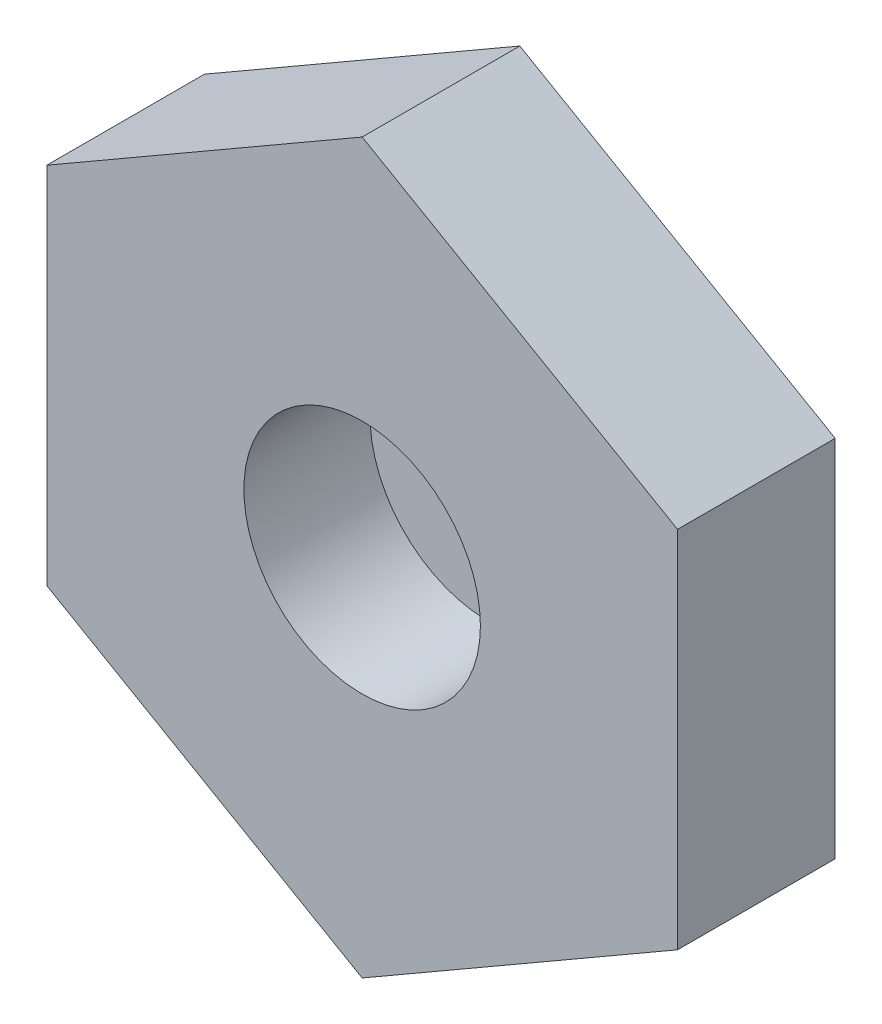
ISO-10303-21;
HEADER;
FILE_DESCRIPTION(('STEP AP214'),'2;1');
FILE_NAME('part.step','',(''),(''),'','','');
FILE_SCHEMA(('AUTOMOTIVE_DESIGN { 1 0 10303 214 1 1 1 1 }'));
ENDSEC;
DATA;
#1=APPLICATION_CONTEXT('core data for automotive mechanical design processes');
#2=APPLICATION_PROTOCOL_DEFINITION('international standard','automotive_design',2000,#1);
#3=PRODUCT_CONTEXT('',#1,'mechanical');
#4=PRODUCT('Part','Part','',(#3));
#5=PRODUCT_RELATED_PRODUCT_CATEGORY('part','',(#4));
#6=PRODUCT_DEFINITION_FORMATION('','',#4);
#7=PRODUCT_DEFINITION_CONTEXT('part definition',#1,'design');
#8=PRODUCT_DEFINITION('design','',#6,#7);
#9=PRODUCT_DEFINITION_SHAPE('','',#8);
#10=(LENGTH_UNIT() NAMED_UNIT(*) SI_UNIT(.MILLI.,.METRE.));
#11=(NAMED_UNIT(*) PLANE_ANGLE_UNIT() SI_UNIT($,.RADIAN.));
#12=(NAMED_UNIT(*) SI_UNIT($,.STERADIAN.) SOLID_ANGLE_UNIT());
#13=UNCERTAINTY_MEASURE_WITH_UNIT(LENGTH_MEASURE(1.E-05),#10,'distance_accuracy_value','');
#14=(GEOMETRIC_REPRESENTATION_CONTEXT(3) GLOBAL_UNCERTAINTY_ASSIGNED_CONTEXT((#13)) GLOBAL_UNIT_ASSIGNED_CONTEXT((#10,
#11,#12)) REPRESENTATION_CONTEXT('',''));
#15=CARTESIAN_POINT('',(0.,0.,0.));
#16=DIRECTION('',(0.,0.,1.));
#17=DIRECTION('',(1.,0.,0.));
#18=AXIS2_PLACEMENT_3D('',#15,#16,#17);
#19=CARTESIAN_POINT('',(8.,4.61880215351701,4.));
#20=DIRECTION('',(-0.5,-0.866025403784439,0.));
#21=DIRECTION('',(0.866025403784439,-0.5,0.));
#22=AXIS2_PLACEMENT_3D('',#19,#20,#21);
#23=PLANE('',#22);
#24=DIRECTION('',(-0.866025403784438,0.5,0.));
#25=VECTOR('',#24,1.);
#26=CARTESIAN_POINT('',(8.,4.61880215351701,0.));
#27=LINE('',#26,#25);
#28=CARTESIAN_POINT('',(8.,4.61880215351701,0.));
#29=VERTEX_POINT('',#28);
#30=CARTESIAN_POINT('',(0.,9.23760430703402,0.));
#31=VERTEX_POINT('',#30);
#32=EDGE_CURVE('E118',#29,#31,#27,.T.);
#33=ORIENTED_EDGE('',*,*,#32,.T.);
#34=DIRECTION('',(0.,0.,-1.));
#35=VECTOR('',#34,1.);
#36=CARTESIAN_POINT('',(0.,9.23760430703402,4.));
#37=LINE('',#36,#35);
#38=CARTESIAN_POINT('',(0.,9.23760430703402,4.));
#39=VERTEX_POINT('',#38);
#40=EDGE_CURVE('E11',#39,#31,#37,.T.);
#41=ORIENTED_EDGE('',*,*,#40,.F.);
#42=DIRECTION('',(-0.866025403784438,0.5,0.));
#43=VECTOR('',#42,1.);
#44=CARTESIAN_POINT('',(8.,4.61880215351701,4.));
#45=LINE('',#44,#43);
#46=CARTESIAN_POINT('',(8.,4.61880215351701,4.));
#47=VERTEX_POINT('',#46);
#48=EDGE_CURVE('E129',#47,#39,#45,.T.);
#49=ORIENTED_EDGE('',*,*,#48,.F.);
#50=DIRECTION('',(0.,0.,-1.));
#51=VECTOR('',#50,1.);
#52=CARTESIAN_POINT('',(8.,4.61880215351701,4.));
#53=LINE('',#52,#51);
#54=EDGE_CURVE('E114',#47,#29,#53,.T.);
#55=ORIENTED_EDGE('',*,*,#54,.T.);
#56=EDGE_LOOP('',(#33,#41,#49,#55));
#57=FACE_BOUND('',#56,.T.);
#58=ADVANCED_FACE('F34',(#57),#23,.F.);
#59=CARTESIAN_POINT('',(0.,9.23760430703402,4.));
#60=DIRECTION('',(0.5,-0.866025403784439,0.));
#61=DIRECTION('',(0.866025403784439,0.5,0.));
#62=AXIS2_PLACEMENT_3D('',#59,#60,#61);
#63=PLANE('',#62);
#64=DIRECTION('',(-0.866025403784439,-0.5,0.));
#65=VECTOR('',#64,1.);
#66=CARTESIAN_POINT('',(0.,9.23760430703402,0.));
#67=LINE('',#66,#65);
#68=CARTESIAN_POINT('',(-8.,4.61880215351701,0.));
#69=VERTEX_POINT('',#68);
#70=EDGE_CURVE('E121',#31,#69,#67,.T.);
#71=ORIENTED_EDGE('',*,*,#70,.T.);
#72=DIRECTION('',(0.,0.,-1.));
#73=VECTOR('',#72,1.);
#74=CARTESIAN_POINT('',(-8.,4.61880215351701,4.));
#75=LINE('',#74,#73);
#76=CARTESIAN_POINT('',(-8.,4.61880215351701,4.));
#77=VERTEX_POINT('',#76);
#78=EDGE_CURVE('E42',#77,#69,#75,.T.);
#79=ORIENTED_EDGE('',*,*,#78,.F.);
#80=DIRECTION('',(-0.866025403784439,-0.5,0.));
#81=VECTOR('',#80,1.);
#82=CARTESIAN_POINT('',(0.,9.23760430703402,4.));
#83=LINE('',#82,#81);
#84=EDGE_CURVE('E87',#39,#77,#83,.T.);
#85=ORIENTED_EDGE('',*,*,#84,.F.);
#86=ORIENTED_EDGE('',*,*,#40,.T.);
#87=EDGE_LOOP('',(#71,#79,#85,#86));
#88=FACE_BOUND('',#87,.T.);
#89=ADVANCED_FACE('F154',(#88),#63,.F.);
#90=CARTESIAN_POINT('',(-8.,4.61880215351701,4.));
#91=DIRECTION('',(1.,0.,0.));
#92=DIRECTION('',(0.,0.,-1.));
#93=AXIS2_PLACEMENT_3D('',#90,#91,#92);
#94=PLANE('',#93);
#95=DIRECTION('',(0.,-1.,0.));
#96=VECTOR('',#95,1.);
#97=CARTESIAN_POINT('',(-8.,4.61880215351701,0.));
#98=LINE('',#97,#96);
#99=CARTESIAN_POINT('',(-8.,-4.61880215351701,0.));
#100=VERTEX_POINT('',#99);
#101=EDGE_CURVE('E124',#69,#100,#98,.T.);
#102=ORIENTED_EDGE('',*,*,#101,.T.);
#103=DIRECTION('',(0.,0.,-1.));
#104=VECTOR('',#103,1.);
#105=CARTESIAN_POINT('',(-8.,-4.61880215351701,4.));
#106=LINE('',#105,#104);
#107=CARTESIAN_POINT('',(-8.,-4.61880215351701,4.));
#108=VERTEX_POINT('',#107);
#109=EDGE_CURVE('E109',#108,#100,#106,.T.);
#110=ORIENTED_EDGE('',*,*,#109,.F.);
#111=DIRECTION('',(0.,-1.,0.));
#112=VECTOR('',#111,1.);
#113=CARTESIAN_POINT('',(-8.,4.61880215351701,4.));
#114=LINE('',#113,#112);
#115=EDGE_CURVE('E100',#77,#108,#114,.T.);
#116=ORIENTED_EDGE('',*,*,#115,.F.);
#117=ORIENTED_EDGE('',*,*,#78,.T.);
#118=EDGE_LOOP('',(#102,#110,#116,#117));
#119=FACE_BOUND('',#118,.T.);
#120=ADVANCED_FACE('F135',(#119),#94,.F.);
#121=CARTESIAN_POINT('',(-8.,-4.61880215351701,4.));
#122=DIRECTION('',(0.5,0.866025403784439,0.));
#123=DIRECTION('',(-0.866025403784439,0.5,0.));
#124=AXIS2_PLACEMENT_3D('',#121,#122,#123);
#125=PLANE('',#124);
#126=DIRECTION('',(0.866025403784438,-0.5,0.));
#127=VECTOR('',#126,1.);
#128=CARTESIAN_POINT('',(-8.,-4.61880215351701,0.));
#129=LINE('',#128,#127);
#130=CARTESIAN_POINT('',(0.,-9.23760430703401,0.));
#131=VERTEX_POINT('',#130);
#132=EDGE_CURVE('E108',#100,#131,#129,.T.);
#133=ORIENTED_EDGE('',*,*,#132,.T.);
#134=DIRECTION('',(0.,0.,-1.));
#135=VECTOR('',#134,1.);
#136=CARTESIAN_POINT('',(0.,-9.23760430703401,4.));
#137=LINE('',#136,#135);
#138=CARTESIAN_POINT('',(0.,-9.23760430703401,4.));
#139=VERTEX_POINT('',#138);
#140=EDGE_CURVE('E105',#139,#131,#137,.T.);
#141=ORIENTED_EDGE('',*,*,#140,.F.);
#142=DIRECTION('',(0.866025403784438,-0.5,0.));
#143=VECTOR('',#142,1.);
#144=CARTESIAN_POINT('',(-8.,-4.61880215351701,4.));
#145=LINE('',#144,#143);
#146=EDGE_CURVE('E94',#108,#139,#145,.T.);
#147=ORIENTED_EDGE('',*,*,#146,.F.);
#148=ORIENTED_EDGE('',*,*,#109,.T.);
#149=EDGE_LOOP('',(#133,#141,#147,#148));
#150=FACE_BOUND('',#149,.T.);
#151=ADVANCED_FACE('F106',(#150),#125,.F.);
#152=CARTESIAN_POINT('',(0.,-9.23760430703401,4.));
#153=DIRECTION('',(-0.5,0.866025403784439,0.));
#154=DIRECTION('',(-0.866025403784439,-0.5,0.));
#155=AXIS2_PLACEMENT_3D('',#152,#153,#154);
#156=PLANE('',#155);
#157=DIRECTION('',(0.866025403784439,0.5,0.));
#158=VECTOR('',#157,1.);
#159=CARTESIAN_POINT('',(0.,-9.23760430703401,0.));
#160=LINE('',#159,#158);
#161=CARTESIAN_POINT('',(8.,-4.61880215351701,0.));
#162=VERTEX_POINT('',#161);
#163=EDGE_CURVE('E73',#131,#162,#160,.T.);
#164=ORIENTED_EDGE('',*,*,#163,.T.);
#165=DIRECTION('',(0.,0.,-1.));
#166=VECTOR('',#165,1.);
#167=CARTESIAN_POINT('',(8.,-4.61880215351701,4.));
#168=LINE('',#167,#166);
#169=CARTESIAN_POINT('',(8.,-4.61880215351701,4.));
#170=VERTEX_POINT('',#169);
#171=EDGE_CURVE('E110',#170,#162,#168,.T.);
#172=ORIENTED_EDGE('',*,*,#171,.F.);
#173=DIRECTION('',(0.866025403784439,0.5,0.));
#174=VECTOR('',#173,1.);
#175=CARTESIAN_POINT('',(0.,-9.23760430703401,4.));
#176=LINE('',#175,#174);
#177=EDGE_CURVE('E98',#139,#170,#176,.T.);
#178=ORIENTED_EDGE('',*,*,#177,.F.);
#179=ORIENTED_EDGE('',*,*,#140,.T.);
#180=EDGE_LOOP('',(#164,#172,#178,#179));
#181=FACE_BOUND('',#180,.T.);
#182=ADVANCED_FACE('F112',(#181),#156,.F.);
#183=CARTESIAN_POINT('',(8.,-4.61880215351701,4.));
#184=DIRECTION('',(-1.,0.,0.));
#185=DIRECTION('',(0.,0.,1.));
#186=AXIS2_PLACEMENT_3D('',#183,#184,#185);
#187=PLANE('',#186);
#188=DIRECTION('',(0.,1.,0.));
#189=VECTOR('',#188,1.);
#190=CARTESIAN_POINT('',(8.,-4.61880215351701,0.));
#191=LINE('',#190,#189);
#192=EDGE_CURVE('E79',#162,#29,#191,.T.);
#193=ORIENTED_EDGE('',*,*,#192,.T.);
#194=ORIENTED_EDGE('',*,*,#54,.F.);
#195=DIRECTION('',(0.,1.,0.));
#196=VECTOR('',#195,1.);
#197=CARTESIAN_POINT('',(8.,-4.61880215351701,4.));
#198=LINE('',#197,#196);
#199=EDGE_CURVE('E50',#170,#47,#198,.T.);
#200=ORIENTED_EDGE('',*,*,#199,.F.);
#201=ORIENTED_EDGE('',*,*,#171,.T.);
#202=EDGE_LOOP('',(#193,#194,#200,#201));
#203=FACE_BOUND('',#202,.T.);
#204=ADVANCED_FACE('F142',(#203),#187,.F.);
#205=CARTESIAN_POINT('',(0.,0.,4.));
#206=DIRECTION('',(0.,0.,1.));
#207=DIRECTION('',(1.,0.,0.));
#208=AXIS2_PLACEMENT_3D('',#205,#206,#207);
#209=PLANE('',#208);
#210=CARTESIAN_POINT('',(0.,0.,4.));
#211=DIRECTION('',(0.,0.,1.));
#212=DIRECTION('',(1.,0.,0.));
#213=AXIS2_PLACEMENT_3D('',#210,#211,#212);
#214=CIRCLE('',#213,3.);
#215=CARTESIAN_POINT('',(3.,0.,4.));
#216=VERTEX_POINT('',#215);
#217=EDGE_CURVE('E215',#216,#216,#214,.T.);
#218=ORIENTED_EDGE('',*,*,#217,.F.);
#219=EDGE_LOOP('',(#218));
#220=FACE_BOUND('',#219,.T.);
#221=ORIENTED_EDGE('',*,*,#48,.T.);
#222=ORIENTED_EDGE('',*,*,#84,.T.);
#223=ORIENTED_EDGE('',*,*,#115,.T.);
#224=ORIENTED_EDGE('',*,*,#146,.T.);
#225=ORIENTED_EDGE('',*,*,#177,.T.);
#226=ORIENTED_EDGE('',*,*,#199,.T.);
#227=EDGE_LOOP('',(#221,#222,#223,#224,#225,#226));
#228=FACE_BOUND('',#227,.T.);
#229=ADVANCED_FACE('F96',(#220,#228),#209,.T.);
#230=CARTESIAN_POINT('',(0.,0.,0.));
#231=DIRECTION('',(0.,0.,1.));
#232=DIRECTION('',(1.,0.,0.));
#233=AXIS2_PLACEMENT_3D('',#230,#231,#232);
#234=PLANE('',#233);
#235=ORIENTED_EDGE('',*,*,#32,.F.);
#236=ORIENTED_EDGE('',*,*,#192,.F.);
#237=ORIENTED_EDGE('',*,*,#163,.F.);
#238=ORIENTED_EDGE('',*,*,#132,.F.);
#239=ORIENTED_EDGE('',*,*,#101,.F.);
#240=ORIENTED_EDGE('',*,*,#70,.F.);
#241=EDGE_LOOP('',(#235,#236,#237,#238,#239,#240));
#242=FACE_BOUND('',#241,.T.);
#243=ADVANCED_FACE('F138',(#242),#234,.F.);
#244=CARTESIAN_POINT('',(0.,0.,0.8));
#245=DIRECTION('',(0.,0.,1.));
#246=DIRECTION('',(1.,0.,0.));
#247=AXIS2_PLACEMENT_3D('',#244,#245,#246);
#248=CYLINDRICAL_SURFACE('',#247,3.);
#249=CARTESIAN_POINT('',(0.,0.,0.8));
#250=DIRECTION('',(0.,0.,1.));
#251=DIRECTION('',(1.,0.,0.));
#252=AXIS2_PLACEMENT_3D('',#249,#250,#251);
#253=CIRCLE('',#252,3.);
#254=CARTESIAN_POINT('',(3.,0.,0.8));
#255=VERTEX_POINT('',#254);
#256=EDGE_CURVE('E122',#255,#255,#253,.T.);
#257=ORIENTED_EDGE('',*,*,#256,.F.);
#258=EDGE_LOOP('',(#257));
#259=FACE_BOUND('',#258,.T.);
#260=ORIENTED_EDGE('',*,*,#217,.T.);
#261=EDGE_LOOP('',(#260));
#262=FACE_BOUND('',#261,.T.);
#263=ADVANCED_FACE('F186',(#259,#262),#248,.F.);
#264=CARTESIAN_POINT('',(0.,0.,0.8));
#265=DIRECTION('',(0.,0.,1.));
#266=DIRECTION('',(1.,0.,0.));
#267=AXIS2_PLACEMENT_3D('',#264,#265,#266);
#268=PLANE('',#267);
#269=ORIENTED_EDGE('',*,*,#256,.T.);
#270=EDGE_LOOP('',(#269));
#271=FACE_BOUND('',#270,.T.);
#272=ADVANCED_FACE('F199',(#271),#268,.T.);
#273=CLOSED_SHELL('',(#58,#89,#120,#151,#182,#204,#229,#243,#263,#272));
#274=MANIFOLD_SOLID_BREP('B2',#273);
#275=ADVANCED_BREP_SHAPE_REPRESENTATION('',(#18,#274),#14);
#276=SHAPE_DEFINITION_REPRESENTATION(#9,#275);
ENDSEC;
END-ISO-10303-21;
